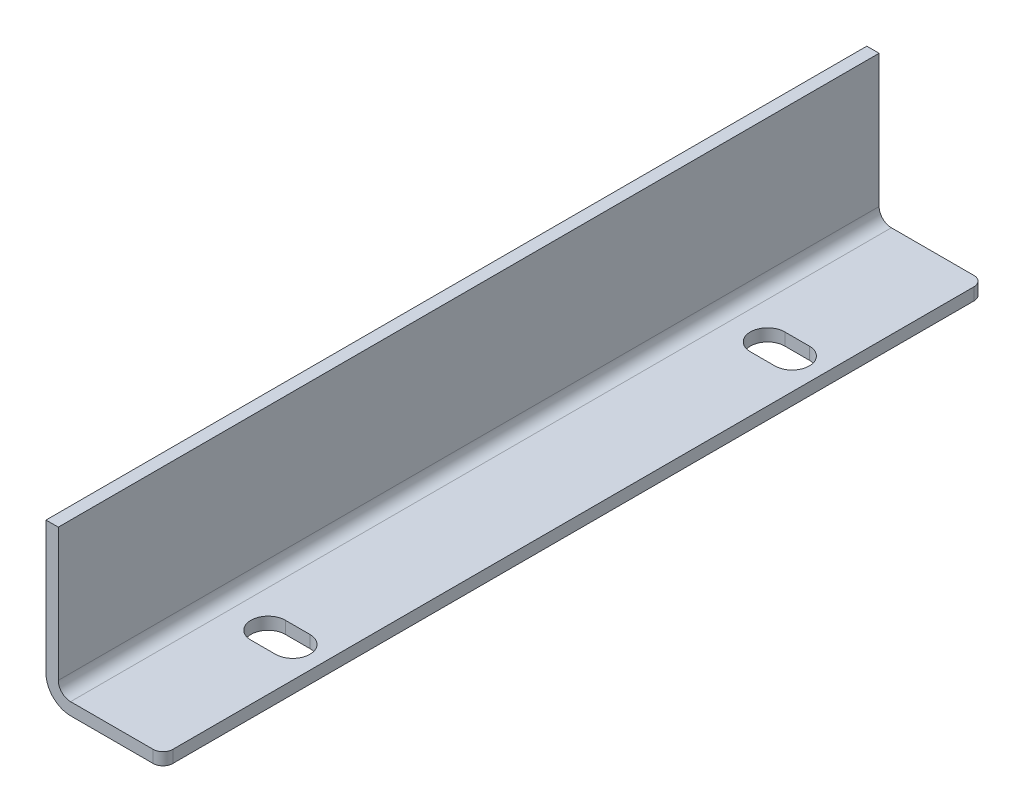
ISO-10303-21;
HEADER;
FILE_DESCRIPTION(('STEP AP214'),'2;1');
FILE_NAME('part.step','',(''),(''),'','','');
FILE_SCHEMA(('AUTOMOTIVE_DESIGN { 1 0 10303 214 1 1 1 1 }'));
ENDSEC;
DATA;
#1=APPLICATION_CONTEXT('core data for automotive mechanical design processes');
#2=APPLICATION_PROTOCOL_DEFINITION('international standard','automotive_design',2000,#1);
#3=PRODUCT_CONTEXT('',#1,'mechanical');
#4=PRODUCT('Part','Part','',(#3));
#5=PRODUCT_RELATED_PRODUCT_CATEGORY('part','',(#4));
#6=PRODUCT_DEFINITION_FORMATION('','',#4);
#7=PRODUCT_DEFINITION_CONTEXT('part definition',#1,'design');
#8=PRODUCT_DEFINITION('design','',#6,#7);
#9=PRODUCT_DEFINITION_SHAPE('','',#8);
#10=(LENGTH_UNIT() NAMED_UNIT(*) SI_UNIT(.MILLI.,.METRE.));
#11=(NAMED_UNIT(*) PLANE_ANGLE_UNIT() SI_UNIT($,.RADIAN.));
#12=(NAMED_UNIT(*) SI_UNIT($,.STERADIAN.) SOLID_ANGLE_UNIT());
#13=UNCERTAINTY_MEASURE_WITH_UNIT(LENGTH_MEASURE(1.E-05),#10,'distance_accuracy_value','');
#14=(GEOMETRIC_REPRESENTATION_CONTEXT(3) GLOBAL_UNCERTAINTY_ASSIGNED_CONTEXT((#13)) GLOBAL_UNIT_ASSIGNED_CONTEXT((#10,
#11,#12)) REPRESENTATION_CONTEXT('',''));
#15=CARTESIAN_POINT('',(0.,0.,0.));
#16=DIRECTION('',(0.,0.,1.));
#17=DIRECTION('',(1.,0.,0.));
#18=AXIS2_PLACEMENT_3D('',#15,#16,#17);
#19=CARTESIAN_POINT('',(9.9,0.,-81.5));
#20=DIRECTION('',(0.,1.,0.));
#21=DIRECTION('',(0.707106781186548,0.,-0.707106781186548));
#22=AXIS2_PLACEMENT_3D('',#19,#20,#21);
#23=CYLINDRICAL_SURFACE('',#22,2.);
#24=CARTESIAN_POINT('',(9.9,2.5,-81.5));
#25=DIRECTION('',(0.,-1.,0.));
#26=DIRECTION('',(0.707106781186548,0.,-0.707106781186548));
#27=AXIS2_PLACEMENT_3D('',#24,#25,#26);
#28=CIRCLE('',#27,2.);
#29=CARTESIAN_POINT('',(9.9,2.5,-83.5));
#30=VERTEX_POINT('',#29);
#31=CARTESIAN_POINT('',(11.9,2.5,-81.5));
#32=VERTEX_POINT('',#31);
#33=EDGE_CURVE('E11',#30,#32,#28,.T.);
#34=ORIENTED_EDGE('',*,*,#33,.T.);
#35=DIRECTION('',(0.,-1.,0.));
#36=VECTOR('',#35,1.);
#37=CARTESIAN_POINT('',(11.9,0.,-81.5));
#38=LINE('',#37,#36);
#39=CARTESIAN_POINT('',(11.9,0.,-81.5));
#40=VERTEX_POINT('',#39);
#41=EDGE_CURVE('E27',#32,#40,#38,.T.);
#42=ORIENTED_EDGE('',*,*,#41,.T.);
#43=CARTESIAN_POINT('',(9.9,0.,-81.5));
#44=DIRECTION('',(0.,1.,0.));
#45=DIRECTION('',(0.707106781186548,0.,-0.707106781186548));
#46=AXIS2_PLACEMENT_3D('',#43,#44,#45);
#47=CIRCLE('',#46,2.);
#48=CARTESIAN_POINT('',(9.9,0.,-83.5));
#49=VERTEX_POINT('',#48);
#50=EDGE_CURVE('E303',#40,#49,#47,.T.);
#51=ORIENTED_EDGE('',*,*,#50,.T.);
#52=DIRECTION('',(0.,1.,0.));
#53=VECTOR('',#52,1.);
#54=CARTESIAN_POINT('',(9.9,0.,-83.5));
#55=LINE('',#54,#53);
#56=EDGE_CURVE('E300',#49,#30,#55,.T.);
#57=ORIENTED_EDGE('',*,*,#56,.T.);
#58=EDGE_LOOP('',(#34,#42,#51,#57));
#59=FACE_BOUND('',#58,.T.);
#60=ADVANCED_FACE('F17',(#59),#23,.T.);
#61=CARTESIAN_POINT('',(11.9,0.,-83.5));
#62=DIRECTION('',(1.,0.,0.));
#63=DIRECTION('',(0.,0.,-1.));
#64=AXIS2_PLACEMENT_3D('',#61,#62,#63);
#65=PLANE('',#64);
#66=ORIENTED_EDGE('',*,*,#41,.F.);
#67=DIRECTION('',(0.,0.,1.));
#68=VECTOR('',#67,1.);
#69=CARTESIAN_POINT('',(11.9,2.5,-83.5));
#70=LINE('',#69,#68);
#71=CARTESIAN_POINT('',(11.9,2.5,81.5));
#72=VERTEX_POINT('',#71);
#73=EDGE_CURVE('E294',#32,#72,#70,.T.);
#74=ORIENTED_EDGE('',*,*,#73,.T.);
#75=DIRECTION('',(0.,1.,0.));
#76=VECTOR('',#75,1.);
#77=CARTESIAN_POINT('',(11.9,0.,81.5));
#78=LINE('',#77,#76);
#79=CARTESIAN_POINT('',(11.9,0.,81.5));
#80=VERTEX_POINT('',#79);
#81=EDGE_CURVE('E260',#80,#72,#78,.T.);
#82=ORIENTED_EDGE('',*,*,#81,.F.);
#83=DIRECTION('',(0.,0.,1.));
#84=VECTOR('',#83,1.);
#85=CARTESIAN_POINT('',(11.9,0.,-83.5));
#86=LINE('',#85,#84);
#87=EDGE_CURVE('E171',#40,#80,#86,.T.);
#88=ORIENTED_EDGE('',*,*,#87,.F.);
#89=EDGE_LOOP('',(#66,#74,#82,#88));
#90=FACE_BOUND('',#89,.T.);
#91=ADVANCED_FACE('F309',(#90),#65,.T.);
#92=CARTESIAN_POINT('',(0.,2.5,0.));
#93=DIRECTION('',(0.,1.,0.));
#94=DIRECTION('',(0.,0.,1.));
#95=AXIS2_PLACEMENT_3D('',#92,#93,#94);
#96=PLANE('',#95);
#97=ORIENTED_EDGE('',*,*,#33,.F.);
#98=DIRECTION('',(1.,0.,0.));
#99=VECTOR('',#98,1.);
#100=CARTESIAN_POINT('',(-11.9,2.5,-83.5));
#101=LINE('',#100,#99);
#102=CARTESIAN_POINT('',(-6.9,2.5,-83.5));
#103=VERTEX_POINT('',#102);
#104=EDGE_CURVE('E243',#103,#30,#101,.T.);
#105=ORIENTED_EDGE('',*,*,#104,.F.);
#106=DIRECTION('',(0.,0.,1.));
#107=VECTOR('',#106,1.);
#108=CARTESIAN_POINT('',(-6.9,2.5,-41.75));
#109=LINE('',#108,#107);
#110=CARTESIAN_POINT('',(-6.9,2.5,83.5));
#111=VERTEX_POINT('',#110);
#112=EDGE_CURVE('E289',#103,#111,#109,.T.);
#113=ORIENTED_EDGE('',*,*,#112,.T.);
#114=DIRECTION('',(-1.,0.,0.));
#115=VECTOR('',#114,1.);
#116=CARTESIAN_POINT('',(11.9,2.5,83.5));
#117=LINE('',#116,#115);
#118=CARTESIAN_POINT('',(9.9,2.5,83.5));
#119=VERTEX_POINT('',#118);
#120=EDGE_CURVE('E187',#119,#111,#117,.T.);
#121=ORIENTED_EDGE('',*,*,#120,.F.);
#122=CARTESIAN_POINT('',(9.9,2.5,81.5));
#123=DIRECTION('',(0.,-1.,0.));
#124=DIRECTION('',(0.707106781186548,0.,0.707106781186548));
#125=AXIS2_PLACEMENT_3D('',#122,#123,#124);
#126=CIRCLE('',#125,2.);
#127=EDGE_CURVE('E264',#72,#119,#126,.T.);
#128=ORIENTED_EDGE('',*,*,#127,.F.);
#129=ORIENTED_EDGE('',*,*,#73,.F.);
#130=EDGE_LOOP('',(#97,#105,#113,#121,#128,#129));
#131=FACE_BOUND('',#130,.T.);
#132=CARTESIAN_POINT('',(0.6,2.5,-50.805));
#133=DIRECTION('',(0.,-1.,0.));
#134=DIRECTION('',(1.,0.,0.));
#135=AXIS2_PLACEMENT_3D('',#132,#133,#134);
#136=CIRCLE('',#135,3.5);
#137=CARTESIAN_POINT('',(0.6,2.5,-47.305));
#138=VERTEX_POINT('',#137);
#139=CARTESIAN_POINT('',(0.6,2.5,-54.305));
#140=VERTEX_POINT('',#139);
#141=EDGE_CURVE('E287',#138,#140,#136,.T.);
#142=ORIENTED_EDGE('',*,*,#141,.T.);
#143=DIRECTION('',(1.,0.,0.));
#144=VECTOR('',#143,1.);
#145=CARTESIAN_POINT('',(0.3,2.5,-54.305));
#146=LINE('',#145,#144);
#147=CARTESIAN_POINT('',(5.6,2.5,-54.305));
#148=VERTEX_POINT('',#147);
#149=EDGE_CURVE('E284',#140,#148,#146,.T.);
#150=ORIENTED_EDGE('',*,*,#149,.T.);
#151=CARTESIAN_POINT('',(5.6,2.5,-50.805));
#152=DIRECTION('',(0.,-1.,0.));
#153=DIRECTION('',(-1.,0.,0.));
#154=AXIS2_PLACEMENT_3D('',#151,#152,#153);
#155=CIRCLE('',#154,3.5);
#156=CARTESIAN_POINT('',(5.6,2.5,-47.305));
#157=VERTEX_POINT('',#156);
#158=EDGE_CURVE('E281',#148,#157,#155,.T.);
#159=ORIENTED_EDGE('',*,*,#158,.T.);
#160=DIRECTION('',(-1.,0.,0.));
#161=VECTOR('',#160,1.);
#162=CARTESIAN_POINT('',(2.8,2.5,-47.305));
#163=LINE('',#162,#161);
#164=EDGE_CURVE('E279',#157,#138,#163,.T.);
#165=ORIENTED_EDGE('',*,*,#164,.T.);
#166=EDGE_LOOP('',(#142,#150,#159,#165));
#167=FACE_BOUND('',#166,.T.);
#168=CARTESIAN_POINT('',(0.6,2.5,50.805));
#169=DIRECTION('',(0.,-1.,0.));
#170=DIRECTION('',(1.,0.,0.));
#171=AXIS2_PLACEMENT_3D('',#168,#169,#170);
#172=CIRCLE('',#171,3.5);
#173=CARTESIAN_POINT('',(0.6,2.5,54.305));
#174=VERTEX_POINT('',#173);
#175=CARTESIAN_POINT('',(0.6,2.5,47.305));
#176=VERTEX_POINT('',#175);
#177=EDGE_CURVE('E276',#174,#176,#172,.T.);
#178=ORIENTED_EDGE('',*,*,#177,.T.);
#179=DIRECTION('',(1.,0.,0.));
#180=VECTOR('',#179,1.);
#181=CARTESIAN_POINT('',(2.8,2.5,47.305));
#182=LINE('',#181,#180);
#183=CARTESIAN_POINT('',(5.6,2.5,47.305));
#184=VERTEX_POINT('',#183);
#185=EDGE_CURVE('E273',#176,#184,#182,.T.);
#186=ORIENTED_EDGE('',*,*,#185,.T.);
#187=CARTESIAN_POINT('',(5.6,2.5,50.805));
#188=DIRECTION('',(0.,-1.,0.));
#189=DIRECTION('',(-1.,0.,0.));
#190=AXIS2_PLACEMENT_3D('',#187,#188,#189);
#191=CIRCLE('',#190,3.5);
#192=CARTESIAN_POINT('',(5.6,2.5,54.305));
#193=VERTEX_POINT('',#192);
#194=EDGE_CURVE('E270',#184,#193,#191,.T.);
#195=ORIENTED_EDGE('',*,*,#194,.T.);
#196=DIRECTION('',(-1.,0.,0.));
#197=VECTOR('',#196,1.);
#198=CARTESIAN_POINT('',(0.3,2.5,54.305));
#199=LINE('',#198,#197);
#200=EDGE_CURVE('E266',#193,#174,#199,.T.);
#201=ORIENTED_EDGE('',*,*,#200,.T.);
#202=EDGE_LOOP('',(#178,#186,#195,#201));
#203=FACE_BOUND('',#202,.T.);
#204=ADVANCED_FACE('F311',(#131,#167,#203),#96,.T.);
#205=CARTESIAN_POINT('',(9.9,0.,81.5));
#206=DIRECTION('',(0.,1.,0.));
#207=DIRECTION('',(0.707106781186548,0.,0.707106781186548));
#208=AXIS2_PLACEMENT_3D('',#205,#206,#207);
#209=CYLINDRICAL_SURFACE('',#208,2.);
#210=ORIENTED_EDGE('',*,*,#127,.T.);
#211=DIRECTION('',(0.,-1.,0.));
#212=VECTOR('',#211,1.);
#213=CARTESIAN_POINT('',(9.9,0.,83.5));
#214=LINE('',#213,#212);
#215=CARTESIAN_POINT('',(9.9,0.,83.5));
#216=VERTEX_POINT('',#215);
#217=EDGE_CURVE('E255',#119,#216,#214,.T.);
#218=ORIENTED_EDGE('',*,*,#217,.T.);
#219=CARTESIAN_POINT('',(9.9,0.,81.5));
#220=DIRECTION('',(0.,1.,0.));
#221=DIRECTION('',(0.707106781186548,0.,0.707106781186548));
#222=AXIS2_PLACEMENT_3D('',#219,#220,#221);
#223=CIRCLE('',#222,2.);
#224=EDGE_CURVE('E257',#216,#80,#223,.T.);
#225=ORIENTED_EDGE('',*,*,#224,.T.);
#226=ORIENTED_EDGE('',*,*,#81,.T.);
#227=EDGE_LOOP('',(#210,#218,#225,#226));
#228=FACE_BOUND('',#227,.T.);
#229=ADVANCED_FACE('F262',(#228),#209,.T.);
#230=CARTESIAN_POINT('',(11.9,0.,83.5));
#231=DIRECTION('',(0.,0.,1.));
#232=DIRECTION('',(1.,0.,0.));
#233=AXIS2_PLACEMENT_3D('',#230,#231,#232);
#234=PLANE('',#233);
#235=ORIENTED_EDGE('',*,*,#217,.F.);
#236=ORIENTED_EDGE('',*,*,#120,.T.);
#237=CARTESIAN_POINT('',(-6.9,5.,83.5));
#238=DIRECTION('',(0.,0.,-1.));
#239=DIRECTION('',(0.,-1.,0.));
#240=AXIS2_PLACEMENT_3D('',#237,#238,#239);
#241=CIRCLE('',#240,2.5);
#242=CARTESIAN_POINT('',(-9.4,5.,83.5));
#243=VERTEX_POINT('',#242);
#244=EDGE_CURVE('E161',#111,#243,#241,.T.);
#245=ORIENTED_EDGE('',*,*,#244,.T.);
#246=DIRECTION('',(0.,1.,0.));
#247=VECTOR('',#246,1.);
#248=CARTESIAN_POINT('',(-9.4,5.,83.5));
#249=LINE('',#248,#247);
#250=CARTESIAN_POINT('',(-9.4,32.,83.5));
#251=VERTEX_POINT('',#250);
#252=EDGE_CURVE('E157',#243,#251,#249,.T.);
#253=ORIENTED_EDGE('',*,*,#252,.T.);
#254=DIRECTION('',(1.,0.,0.));
#255=VECTOR('',#254,1.);
#256=CARTESIAN_POINT('',(-11.9,32.,83.5));
#257=LINE('',#256,#255);
#258=CARTESIAN_POINT('',(-11.9,32.,83.5));
#259=VERTEX_POINT('',#258);
#260=EDGE_CURVE('E144',#259,#251,#257,.T.);
#261=ORIENTED_EDGE('',*,*,#260,.F.);
#262=DIRECTION('',(0.,1.,0.));
#263=VECTOR('',#262,1.);
#264=CARTESIAN_POINT('',(-11.9,-6.309733552923,83.5));
#265=LINE('',#264,#263);
#266=CARTESIAN_POINT('',(-11.9,5.,83.5));
#267=VERTEX_POINT('',#266);
#268=EDGE_CURVE('E238',#267,#259,#265,.T.);
#269=ORIENTED_EDGE('',*,*,#268,.F.);
#270=CARTESIAN_POINT('',(-6.9,5.,83.5));
#271=DIRECTION('',(0.,0.,-1.));
#272=DIRECTION('',(0.,-1.,0.));
#273=AXIS2_PLACEMENT_3D('',#270,#271,#272);
#274=CIRCLE('',#273,5.);
#275=CARTESIAN_POINT('',(-6.9,0.,83.5));
#276=VERTEX_POINT('',#275);
#277=EDGE_CURVE('E225',#276,#267,#274,.T.);
#278=ORIENTED_EDGE('',*,*,#277,.F.);
#279=DIRECTION('',(-1.,0.,0.));
#280=VECTOR('',#279,1.);
#281=CARTESIAN_POINT('',(11.9,0.,83.5));
#282=LINE('',#281,#280);
#283=EDGE_CURVE('E170',#216,#276,#282,.T.);
#284=ORIENTED_EDGE('',*,*,#283,.F.);
#285=EDGE_LOOP('',(#235,#236,#245,#253,#261,#269,#278,#284));
#286=FACE_BOUND('',#285,.T.);
#287=ADVANCED_FACE('F159',(#286),#234,.T.);
#288=CARTESIAN_POINT('',(0.6,0.,-50.805));
#289=DIRECTION('',(0.,-1.,0.));
#290=DIRECTION('',(1.,0.,0.));
#291=AXIS2_PLACEMENT_3D('',#288,#289,#290);
#292=CYLINDRICAL_SURFACE('',#291,3.5);
#293=CARTESIAN_POINT('',(0.6,0.,-50.805));
#294=DIRECTION('',(0.,1.,0.));
#295=DIRECTION('',(1.,0.,0.));
#296=AXIS2_PLACEMENT_3D('',#293,#294,#295);
#297=CIRCLE('',#296,3.5);
#298=CARTESIAN_POINT('',(0.6,0.,-54.305));
#299=VERTEX_POINT('',#298);
#300=CARTESIAN_POINT('',(0.6,0.,-47.305));
#301=VERTEX_POINT('',#300);
#302=EDGE_CURVE('E173',#299,#301,#297,.T.);
#303=ORIENTED_EDGE('',*,*,#302,.F.);
#304=DIRECTION('',(0.,1.,0.));
#305=VECTOR('',#304,1.);
#306=CARTESIAN_POINT('',(0.6,0.,-54.305));
#307=LINE('',#306,#305);
#308=EDGE_CURVE('E184',#299,#140,#307,.T.);
#309=ORIENTED_EDGE('',*,*,#308,.T.);
#310=ORIENTED_EDGE('',*,*,#141,.F.);
#311=DIRECTION('',(0.,1.,0.));
#312=VECTOR('',#311,1.);
#313=CARTESIAN_POINT('',(0.6,0.,-47.305));
#314=LINE('',#313,#312);
#315=EDGE_CURVE('E188',#301,#138,#314,.T.);
#316=ORIENTED_EDGE('',*,*,#315,.F.);
#317=EDGE_LOOP('',(#303,#309,#310,#316));
#318=FACE_BOUND('',#317,.T.);
#319=ADVANCED_FACE('F342',(#318),#292,.F.);
#320=CARTESIAN_POINT('',(5.6,0.,-47.305));
#321=DIRECTION('',(0.,0.,-1.));
#322=DIRECTION('',(-1.,0.,0.));
#323=AXIS2_PLACEMENT_3D('',#320,#321,#322);
#324=PLANE('',#323);
#325=DIRECTION('',(1.,0.,0.));
#326=VECTOR('',#325,1.);
#327=CARTESIAN_POINT('',(2.8,0.,-47.305));
#328=LINE('',#327,#326);
#329=CARTESIAN_POINT('',(5.6,0.,-47.305));
#330=VERTEX_POINT('',#329);
#331=EDGE_CURVE('E175',#301,#330,#328,.T.);
#332=ORIENTED_EDGE('',*,*,#331,.F.);
#333=ORIENTED_EDGE('',*,*,#315,.T.);
#334=ORIENTED_EDGE('',*,*,#164,.F.);
#335=DIRECTION('',(0.,1.,0.));
#336=VECTOR('',#335,1.);
#337=CARTESIAN_POINT('',(5.6,0.,-47.305));
#338=LINE('',#337,#336);
#339=EDGE_CURVE('E190',#330,#157,#338,.T.);
#340=ORIENTED_EDGE('',*,*,#339,.F.);
#341=EDGE_LOOP('',(#332,#333,#334,#340));
#342=FACE_BOUND('',#341,.T.);
#343=ADVANCED_FACE('F345',(#342),#324,.T.);
#344=CARTESIAN_POINT('',(5.6,0.,-50.805));
#345=DIRECTION('',(0.,-1.,0.));
#346=DIRECTION('',(-1.,0.,0.));
#347=AXIS2_PLACEMENT_3D('',#344,#345,#346);
#348=CYLINDRICAL_SURFACE('',#347,3.5);
#349=CARTESIAN_POINT('',(5.6,0.,-50.805));
#350=DIRECTION('',(0.,1.,0.));
#351=DIRECTION('',(-1.,0.,0.));
#352=AXIS2_PLACEMENT_3D('',#349,#350,#351);
#353=CIRCLE('',#352,3.5);
#354=CARTESIAN_POINT('',(5.6,0.,-54.305));
#355=VERTEX_POINT('',#354);
#356=EDGE_CURVE('E180',#330,#355,#353,.T.);
#357=ORIENTED_EDGE('',*,*,#356,.F.);
#358=ORIENTED_EDGE('',*,*,#339,.T.);
#359=ORIENTED_EDGE('',*,*,#158,.F.);
#360=DIRECTION('',(0.,1.,0.));
#361=VECTOR('',#360,1.);
#362=CARTESIAN_POINT('',(5.6,0.,-54.305));
#363=LINE('',#362,#361);
#364=EDGE_CURVE('E194',#355,#148,#363,.T.);
#365=ORIENTED_EDGE('',*,*,#364,.F.);
#366=EDGE_LOOP('',(#357,#358,#359,#365));
#367=FACE_BOUND('',#366,.T.);
#368=ADVANCED_FACE('F349',(#367),#348,.F.);
#369=CARTESIAN_POINT('',(0.6,0.,-54.305));
#370=DIRECTION('',(0.,0.,1.));
#371=DIRECTION('',(1.,0.,0.));
#372=AXIS2_PLACEMENT_3D('',#369,#370,#371);
#373=PLANE('',#372);
#374=DIRECTION('',(-1.,0.,0.));
#375=VECTOR('',#374,1.);
#376=CARTESIAN_POINT('',(0.3,0.,-54.305));
#377=LINE('',#376,#375);
#378=EDGE_CURVE('E196',#355,#299,#377,.T.);
#379=ORIENTED_EDGE('',*,*,#378,.F.);
#380=ORIENTED_EDGE('',*,*,#364,.T.);
#381=ORIENTED_EDGE('',*,*,#149,.F.);
#382=ORIENTED_EDGE('',*,*,#308,.F.);
#383=EDGE_LOOP('',(#379,#380,#381,#382));
#384=FACE_BOUND('',#383,.T.);
#385=ADVANCED_FACE('F353',(#384),#373,.T.);
#386=CARTESIAN_POINT('',(0.6,0.,50.805));
#387=DIRECTION('',(0.,1.,0.));
#388=DIRECTION('',(1.,0.,0.));
#389=AXIS2_PLACEMENT_3D('',#386,#387,#388);
#390=CYLINDRICAL_SURFACE('',#389,3.5);
#391=CARTESIAN_POINT('',(0.6,0.,50.805));
#392=DIRECTION('',(0.,1.,0.));
#393=DIRECTION('',(1.,0.,0.));
#394=AXIS2_PLACEMENT_3D('',#391,#392,#393);
#395=CIRCLE('',#394,3.5);
#396=CARTESIAN_POINT('',(0.6,0.,47.305));
#397=VERTEX_POINT('',#396);
#398=CARTESIAN_POINT('',(0.6,0.,54.305));
#399=VERTEX_POINT('',#398);
#400=EDGE_CURVE('E201',#397,#399,#395,.T.);
#401=ORIENTED_EDGE('',*,*,#400,.F.);
#402=DIRECTION('',(0.,1.,0.));
#403=VECTOR('',#402,1.);
#404=CARTESIAN_POINT('',(0.6,0.,47.305));
#405=LINE('',#404,#403);
#406=EDGE_CURVE('E199',#397,#176,#405,.T.);
#407=ORIENTED_EDGE('',*,*,#406,.T.);
#408=ORIENTED_EDGE('',*,*,#177,.F.);
#409=DIRECTION('',(0.,1.,0.));
#410=VECTOR('',#409,1.);
#411=CARTESIAN_POINT('',(0.6,0.,54.305));
#412=LINE('',#411,#410);
#413=EDGE_CURVE('E207',#399,#174,#412,.T.);
#414=ORIENTED_EDGE('',*,*,#413,.F.);
#415=EDGE_LOOP('',(#401,#407,#408,#414));
#416=FACE_BOUND('',#415,.T.);
#417=ADVANCED_FACE('F357',(#416),#390,.F.);
#418=CARTESIAN_POINT('',(5.6,0.,47.305));
#419=DIRECTION('',(0.,0.,-1.));
#420=DIRECTION('',(-1.,0.,0.));
#421=AXIS2_PLACEMENT_3D('',#418,#419,#420);
#422=PLANE('',#421);
#423=DIRECTION('',(-1.,0.,0.));
#424=VECTOR('',#423,1.);
#425=CARTESIAN_POINT('',(2.8,0.,47.305));
#426=LINE('',#425,#424);
#427=CARTESIAN_POINT('',(5.6,0.,47.305));
#428=VERTEX_POINT('',#427);
#429=EDGE_CURVE('E212',#428,#397,#426,.T.);
#430=ORIENTED_EDGE('',*,*,#429,.F.);
#431=DIRECTION('',(0.,1.,0.));
#432=VECTOR('',#431,1.);
#433=CARTESIAN_POINT('',(5.6,0.,47.305));
#434=LINE('',#433,#432);
#435=EDGE_CURVE('E206',#428,#184,#434,.T.);
#436=ORIENTED_EDGE('',*,*,#435,.T.);
#437=ORIENTED_EDGE('',*,*,#185,.F.);
#438=ORIENTED_EDGE('',*,*,#406,.F.);
#439=EDGE_LOOP('',(#430,#436,#437,#438));
#440=FACE_BOUND('',#439,.T.);
#441=ADVANCED_FACE('F361',(#440),#422,.F.);
#442=CARTESIAN_POINT('',(5.6,0.,50.805));
#443=DIRECTION('',(0.,1.,0.));
#444=DIRECTION('',(-1.,0.,0.));
#445=AXIS2_PLACEMENT_3D('',#442,#443,#444);
#446=CYLINDRICAL_SURFACE('',#445,3.5);
#447=CARTESIAN_POINT('',(5.6,0.,50.805));
#448=DIRECTION('',(0.,1.,0.));
#449=DIRECTION('',(-1.,0.,0.));
#450=AXIS2_PLACEMENT_3D('',#447,#448,#449);
#451=CIRCLE('',#450,3.5);
#452=CARTESIAN_POINT('',(5.6,0.,54.305));
#453=VERTEX_POINT('',#452);
#454=EDGE_CURVE('E215',#453,#428,#451,.T.);
#455=ORIENTED_EDGE('',*,*,#454,.F.);
#456=DIRECTION('',(0.,1.,0.));
#457=VECTOR('',#456,1.);
#458=CARTESIAN_POINT('',(5.6,0.,54.305));
#459=LINE('',#458,#457);
#460=EDGE_CURVE('E210',#453,#193,#459,.T.);
#461=ORIENTED_EDGE('',*,*,#460,.T.);
#462=ORIENTED_EDGE('',*,*,#194,.F.);
#463=ORIENTED_EDGE('',*,*,#435,.F.);
#464=EDGE_LOOP('',(#455,#461,#462,#463));
#465=FACE_BOUND('',#464,.T.);
#466=ADVANCED_FACE('F326',(#465),#446,.F.);
#467=CARTESIAN_POINT('',(0.6,0.,54.305));
#468=DIRECTION('',(0.,0.,1.));
#469=DIRECTION('',(1.,0.,0.));
#470=AXIS2_PLACEMENT_3D('',#467,#468,#469);
#471=PLANE('',#470);
#472=DIRECTION('',(1.,0.,0.));
#473=VECTOR('',#472,1.);
#474=CARTESIAN_POINT('',(0.3,0.,54.305));
#475=LINE('',#474,#473);
#476=EDGE_CURVE('E203',#399,#453,#475,.T.);
#477=ORIENTED_EDGE('',*,*,#476,.F.);
#478=ORIENTED_EDGE('',*,*,#413,.T.);
#479=ORIENTED_EDGE('',*,*,#200,.F.);
#480=ORIENTED_EDGE('',*,*,#460,.F.);
#481=EDGE_LOOP('',(#477,#478,#479,#480));
#482=FACE_BOUND('',#481,.T.);
#483=ADVANCED_FACE('F318',(#482),#471,.F.);
#484=CARTESIAN_POINT('',(-6.9,5.,0.));
#485=DIRECTION('',(0.,0.,-1.));
#486=DIRECTION('',(0.,-1.,0.));
#487=AXIS2_PLACEMENT_3D('',#484,#485,#486);
#488=CYLINDRICAL_SURFACE('',#487,2.5);
#489=DIRECTION('',(0.,0.,-1.));
#490=VECTOR('',#489,1.);
#491=CARTESIAN_POINT('',(-9.4,5.,0.));
#492=LINE('',#491,#490);
#493=CARTESIAN_POINT('',(-9.4,5.,-83.5));
#494=VERTEX_POINT('',#493);
#495=EDGE_CURVE('E153',#243,#494,#492,.T.);
#496=ORIENTED_EDGE('',*,*,#495,.F.);
#497=ORIENTED_EDGE('',*,*,#244,.F.);
#498=ORIENTED_EDGE('',*,*,#112,.F.);
#499=CARTESIAN_POINT('',(-6.9,5.,-83.5));
#500=DIRECTION('',(0.,0.,1.));
#501=DIRECTION('',(-1.,0.,0.));
#502=AXIS2_PLACEMENT_3D('',#499,#500,#501);
#503=CIRCLE('',#502,2.5);
#504=EDGE_CURVE('E227',#494,#103,#503,.T.);
#505=ORIENTED_EDGE('',*,*,#504,.F.);
#506=EDGE_LOOP('',(#496,#497,#498,#505));
#507=FACE_BOUND('',#506,.T.);
#508=ADVANCED_FACE('F316',(#507),#488,.F.);
#509=CARTESIAN_POINT('',(-11.9,5.,-83.5));
#510=DIRECTION('',(0.,0.,-1.));
#511=DIRECTION('',(0.,1.,0.));
#512=AXIS2_PLACEMENT_3D('',#509,#510,#511);
#513=PLANE('',#512);
#514=DIRECTION('',(0.,-1.,0.));
#515=VECTOR('',#514,1.);
#516=CARTESIAN_POINT('',(-9.4,-6.309733552923,-83.5));
#517=LINE('',#516,#515);
#518=CARTESIAN_POINT('',(-9.4,32.,-83.5));
#519=VERTEX_POINT('',#518);
#520=EDGE_CURVE('E167',#519,#494,#517,.T.);
#521=ORIENTED_EDGE('',*,*,#520,.T.);
#522=ORIENTED_EDGE('',*,*,#504,.T.);
#523=ORIENTED_EDGE('',*,*,#104,.T.);
#524=ORIENTED_EDGE('',*,*,#56,.F.);
#525=DIRECTION('',(1.,0.,0.));
#526=VECTOR('',#525,1.);
#527=CARTESIAN_POINT('',(-11.9,0.,-83.5));
#528=LINE('',#527,#526);
#529=CARTESIAN_POINT('',(-6.9,0.,-83.5));
#530=VERTEX_POINT('',#529);
#531=EDGE_CURVE('E21',#530,#49,#528,.T.);
#532=ORIENTED_EDGE('',*,*,#531,.F.);
#533=CARTESIAN_POINT('',(-6.9,5.,-83.5));
#534=DIRECTION('',(0.,0.,-1.));
#535=DIRECTION('',(0.,-1.,0.));
#536=AXIS2_PLACEMENT_3D('',#533,#534,#535);
#537=CIRCLE('',#536,5.);
#538=CARTESIAN_POINT('',(-11.9,5.,-83.5));
#539=VERTEX_POINT('',#538);
#540=EDGE_CURVE('E163',#530,#539,#537,.T.);
#541=ORIENTED_EDGE('',*,*,#540,.T.);
#542=DIRECTION('',(0.,1.,0.));
#543=VECTOR('',#542,1.);
#544=CARTESIAN_POINT('',(-11.9,-6.309733552923,-83.5));
#545=LINE('',#544,#543);
#546=CARTESIAN_POINT('',(-11.9,32.,-83.5));
#547=VERTEX_POINT('',#546);
#548=EDGE_CURVE('E211',#539,#547,#545,.T.);
#549=ORIENTED_EDGE('',*,*,#548,.T.);
#550=DIRECTION('',(1.,0.,0.));
#551=VECTOR('',#550,1.);
#552=CARTESIAN_POINT('',(-11.9,32.,-83.5));
#553=LINE('',#552,#551);
#554=EDGE_CURVE('E232',#547,#519,#553,.T.);
#555=ORIENTED_EDGE('',*,*,#554,.T.);
#556=EDGE_LOOP('',(#521,#522,#523,#524,#532,#541,#549,#555));
#557=FACE_BOUND('',#556,.T.);
#558=ADVANCED_FACE('F246',(#557),#513,.T.);
#559=CARTESIAN_POINT('',(-11.9,15.672566611769,0.));
#560=DIRECTION('',(1.,0.,0.));
#561=DIRECTION('',(0.,0.,1.));
#562=AXIS2_PLACEMENT_3D('',#559,#560,#561);
#563=PLANE('',#562);
#564=DIRECTION('',(0.,0.,1.));
#565=VECTOR('',#564,1.);
#566=CARTESIAN_POINT('',(-11.9,5.,0.));
#567=LINE('',#566,#565);
#568=EDGE_CURVE('E235',#539,#267,#567,.T.);
#569=ORIENTED_EDGE('',*,*,#568,.T.);
#570=ORIENTED_EDGE('',*,*,#268,.T.);
#571=DIRECTION('',(0.,0.,-1.));
#572=VECTOR('',#571,1.);
#573=CARTESIAN_POINT('',(-11.9,32.,83.5));
#574=LINE('',#573,#572);
#575=EDGE_CURVE('E150',#259,#547,#574,.T.);
#576=ORIENTED_EDGE('',*,*,#575,.T.);
#577=ORIENTED_EDGE('',*,*,#548,.F.);
#578=EDGE_LOOP('',(#569,#570,#576,#577));
#579=FACE_BOUND('',#578,.T.);
#580=ADVANCED_FACE('F252',(#579),#563,.F.);
#581=CARTESIAN_POINT('',(-11.9,32.,83.5));
#582=DIRECTION('',(0.,1.,0.));
#583=DIRECTION('',(0.,0.,1.));
#584=AXIS2_PLACEMENT_3D('',#581,#582,#583);
#585=PLANE('',#584);
#586=DIRECTION('',(0.,0.,-1.));
#587=VECTOR('',#586,1.);
#588=CARTESIAN_POINT('',(-9.4,32.,83.5));
#589=LINE('',#588,#587);
#590=EDGE_CURVE('E148',#251,#519,#589,.T.);
#591=ORIENTED_EDGE('',*,*,#590,.T.);
#592=ORIENTED_EDGE('',*,*,#554,.F.);
#593=ORIENTED_EDGE('',*,*,#575,.F.);
#594=ORIENTED_EDGE('',*,*,#260,.T.);
#595=EDGE_LOOP('',(#591,#592,#593,#594));
#596=FACE_BOUND('',#595,.T.);
#597=ADVANCED_FACE('F146',(#596),#585,.T.);
#598=CARTESIAN_POINT('',(-9.4,15.672566611769,0.));
#599=DIRECTION('',(1.,0.,0.));
#600=DIRECTION('',(0.,0.,1.));
#601=AXIS2_PLACEMENT_3D('',#598,#599,#600);
#602=PLANE('',#601);
#603=ORIENTED_EDGE('',*,*,#495,.T.);
#604=ORIENTED_EDGE('',*,*,#520,.F.);
#605=ORIENTED_EDGE('',*,*,#590,.F.);
#606=ORIENTED_EDGE('',*,*,#252,.F.);
#607=EDGE_LOOP('',(#603,#604,#605,#606));
#608=FACE_BOUND('',#607,.T.);
#609=ADVANCED_FACE('F165',(#608),#602,.T.);
#610=CARTESIAN_POINT('',(-6.9,5.,0.));
#611=DIRECTION('',(0.,0.,-1.));
#612=DIRECTION('',(0.,-1.,0.));
#613=AXIS2_PLACEMENT_3D('',#610,#611,#612);
#614=CYLINDRICAL_SURFACE('',#613,5.);
#615=ORIENTED_EDGE('',*,*,#568,.F.);
#616=ORIENTED_EDGE('',*,*,#540,.F.);
#617=DIRECTION('',(0.,0.,-1.));
#618=VECTOR('',#617,1.);
#619=CARTESIAN_POINT('',(-6.9,0.,-41.75));
#620=LINE('',#619,#618);
#621=EDGE_CURVE('E138',#276,#530,#620,.T.);
#622=ORIENTED_EDGE('',*,*,#621,.F.);
#623=ORIENTED_EDGE('',*,*,#277,.T.);
#624=EDGE_LOOP('',(#615,#616,#622,#623));
#625=FACE_BOUND('',#624,.T.);
#626=ADVANCED_FACE('F249',(#625),#614,.T.);
#627=CARTESIAN_POINT('',(0.,0.,0.));
#628=DIRECTION('',(0.,1.,0.));
#629=DIRECTION('',(0.,0.,1.));
#630=AXIS2_PLACEMENT_3D('',#627,#628,#629);
#631=PLANE('',#630);
#632=ORIENTED_EDGE('',*,*,#50,.F.);
#633=ORIENTED_EDGE('',*,*,#87,.T.);
#634=ORIENTED_EDGE('',*,*,#224,.F.);
#635=ORIENTED_EDGE('',*,*,#283,.T.);
#636=ORIENTED_EDGE('',*,*,#621,.T.);
#637=ORIENTED_EDGE('',*,*,#531,.T.);
#638=EDGE_LOOP('',(#632,#633,#634,#635,#636,#637));
#639=FACE_BOUND('',#638,.T.);
#640=ORIENTED_EDGE('',*,*,#302,.T.);
#641=ORIENTED_EDGE('',*,*,#331,.T.);
#642=ORIENTED_EDGE('',*,*,#356,.T.);
#643=ORIENTED_EDGE('',*,*,#378,.T.);
#644=EDGE_LOOP('',(#640,#641,#642,#643));
#645=FACE_BOUND('',#644,.T.);
#646=ORIENTED_EDGE('',*,*,#400,.T.);
#647=ORIENTED_EDGE('',*,*,#476,.T.);
#648=ORIENTED_EDGE('',*,*,#454,.T.);
#649=ORIENTED_EDGE('',*,*,#429,.T.);
#650=EDGE_LOOP('',(#646,#647,#648,#649));
#651=FACE_BOUND('',#650,.T.);
#652=ADVANCED_FACE('F19',(#639,#645,#651),#631,.F.);
#653=CLOSED_SHELL('',(#60,#91,#204,#229,#287,#319,#343,#368,#385,#417,#441,#466,#483,#508,#558,
#580,#597,#609,#626,#652));
#654=MANIFOLD_SOLID_BREP('B1',#653);
#655=ADVANCED_BREP_SHAPE_REPRESENTATION('',(#18,#654),#14);
#656=SHAPE_DEFINITION_REPRESENTATION(#9,#655);
ENDSEC;
END-ISO-10303-21;
